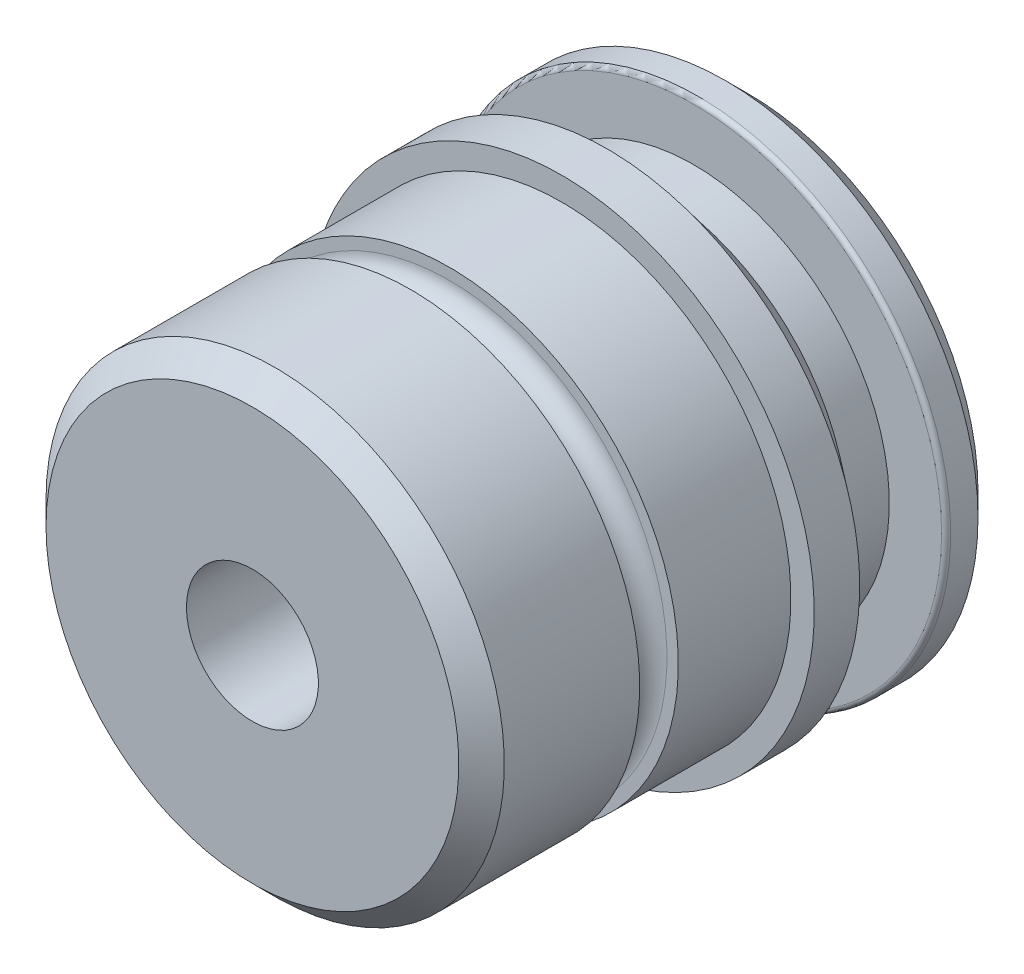
ISO-10303-21;
HEADER;
FILE_DESCRIPTION(('STEP AP214'),'2;1');
FILE_NAME('part.step','',(''),(''),'','','');
FILE_SCHEMA(('AUTOMOTIVE_DESIGN { 1 0 10303 214 1 1 1 1 }'));
ENDSEC;
DATA;
#1=APPLICATION_CONTEXT('core data for automotive mechanical design processes');
#2=APPLICATION_PROTOCOL_DEFINITION('international standard','automotive_design',2000,#1);
#3=PRODUCT_CONTEXT('',#1,'mechanical');
#4=PRODUCT('Part','Part','',(#3));
#5=PRODUCT_RELATED_PRODUCT_CATEGORY('part','',(#4));
#6=PRODUCT_DEFINITION_FORMATION('','',#4);
#7=PRODUCT_DEFINITION_CONTEXT('part definition',#1,'design');
#8=PRODUCT_DEFINITION('design','',#6,#7);
#9=PRODUCT_DEFINITION_SHAPE('','',#8);
#10=(LENGTH_UNIT() NAMED_UNIT(*) SI_UNIT(.MILLI.,.METRE.));
#11=(NAMED_UNIT(*) PLANE_ANGLE_UNIT() SI_UNIT($,.RADIAN.));
#12=(NAMED_UNIT(*) SI_UNIT($,.STERADIAN.) SOLID_ANGLE_UNIT());
#13=UNCERTAINTY_MEASURE_WITH_UNIT(LENGTH_MEASURE(1.E-05),#10,'distance_accuracy_value','');
#14=(GEOMETRIC_REPRESENTATION_CONTEXT(3) GLOBAL_UNCERTAINTY_ASSIGNED_CONTEXT((#13)) GLOBAL_UNIT_ASSIGNED_CONTEXT((#10,
#11,#12)) REPRESENTATION_CONTEXT('',''));
#15=CARTESIAN_POINT('',(0.,0.,0.));
#16=DIRECTION('',(0.,0.,1.));
#17=DIRECTION('',(1.,0.,0.));
#18=AXIS2_PLACEMENT_3D('',#15,#16,#17);
#19=CARTESIAN_POINT('',(11.1,0.,2.4));
#20=DIRECTION('',(0.,0.,-1.));
#21=DIRECTION('',(-1.,0.,0.));
#22=AXIS2_PLACEMENT_3D('',#19,#20,#21);
#23=PLANE('',#22);
#24=CARTESIAN_POINT('',(0.,0.,2.4));
#25=DIRECTION('',(0.,0.,-1.));
#26=DIRECTION('',(-1.,0.,0.));
#27=AXIS2_PLACEMENT_3D('',#24,#25,#26);
#28=CIRCLE('',#27,10.9);
#29=CARTESIAN_POINT('',(-10.9,0.,2.4));
#30=VERTEX_POINT('',#29);
#31=EDGE_CURVE('E10',#30,#30,#28,.F.);
#32=ORIENTED_EDGE('',*,*,#31,.T.);
#33=EDGE_LOOP('',(#32));
#34=FACE_BOUND('',#33,.T.);
#35=CARTESIAN_POINT('',(0.,0.,2.4));
#36=DIRECTION('',(0.,0.,-1.));
#37=DIRECTION('',(-1.,0.,0.));
#38=AXIS2_PLACEMENT_3D('',#35,#36,#37);
#39=CIRCLE('',#38,8.6);
#40=CARTESIAN_POINT('',(-8.6,0.,2.4));
#41=VERTEX_POINT('',#40);
#42=EDGE_CURVE('E107',#41,#41,#39,.T.);
#43=ORIENTED_EDGE('',*,*,#42,.T.);
#44=EDGE_LOOP('',(#43));
#45=FACE_BOUND('',#44,.T.);
#46=ADVANCED_FACE('F30',(#34,#45),#23,.F.);
#47=CARTESIAN_POINT('',(0.,0.,0.));
#48=DIRECTION('',(0.,0.,-1.));
#49=DIRECTION('',(-1.,0.,0.));
#50=AXIS2_PLACEMENT_3D('',#47,#48,#49);
#51=CYLINDRICAL_SURFACE('',#50,11.1);
#52=CARTESIAN_POINT('',(0.,0.,2.2));
#53=DIRECTION('',(0.,0.,-1.));
#54=DIRECTION('',(-1.,0.,0.));
#55=AXIS2_PLACEMENT_3D('',#52,#53,#54);
#56=CIRCLE('',#55,11.1);
#57=CARTESIAN_POINT('',(-11.1,0.,2.2));
#58=VERTEX_POINT('',#57);
#59=EDGE_CURVE('E37',#58,#58,#56,.T.);
#60=ORIENTED_EDGE('',*,*,#59,.T.);
#61=EDGE_LOOP('',(#60));
#62=FACE_BOUND('',#61,.T.);
#63=CARTESIAN_POINT('',(0.,0.,1.00000000000001));
#64=DIRECTION('',(0.,0.,1.));
#65=DIRECTION('',(1.,0.,0.));
#66=AXIS2_PLACEMENT_3D('',#63,#64,#65);
#67=CIRCLE('',#66,11.1);
#68=CARTESIAN_POINT('',(11.1,0.,1.00000000000001));
#69=VERTEX_POINT('',#68);
#70=EDGE_CURVE('E41',#69,#69,#67,.T.);
#71=ORIENTED_EDGE('',*,*,#70,.T.);
#72=EDGE_LOOP('',(#71));
#73=FACE_BOUND('',#72,.T.);
#74=ADVANCED_FACE('F173',(#62,#73),#51,.T.);
#75=CARTESIAN_POINT('',(11.1,0.,0.));
#76=DIRECTION('',(0.,0.,1.));
#77=DIRECTION('',(1.,0.,0.));
#78=AXIS2_PLACEMENT_3D('',#75,#76,#77);
#79=PLANE('',#78);
#80=CARTESIAN_POINT('',(0.,0.,0.));
#81=DIRECTION('',(0.,0.,1.));
#82=DIRECTION('',(1.,0.,0.));
#83=AXIS2_PLACEMENT_3D('',#80,#81,#82);
#84=CIRCLE('',#83,10.1);
#85=CARTESIAN_POINT('',(10.1,0.,0.));
#86=VERTEX_POINT('',#85);
#87=EDGE_CURVE('E45',#86,#86,#84,.F.);
#88=ORIENTED_EDGE('',*,*,#87,.T.);
#89=EDGE_LOOP('',(#88));
#90=FACE_BOUND('',#89,.T.);
#91=CARTESIAN_POINT('',(0.,0.,0.));
#92=DIRECTION('',(0.,0.,1.));
#93=DIRECTION('',(1.,0.,0.));
#94=AXIS2_PLACEMENT_3D('',#91,#92,#93);
#95=CIRCLE('',#94,6.50000000000001);
#96=CARTESIAN_POINT('',(6.50000000000001,0.,0.));
#97=VERTEX_POINT('',#96);
#98=EDGE_CURVE('E50',#97,#97,#95,.T.);
#99=ORIENTED_EDGE('',*,*,#98,.T.);
#100=EDGE_LOOP('',(#99));
#101=FACE_BOUND('',#100,.T.);
#102=ADVANCED_FACE('F178',(#90,#101),#79,.F.);
#103=CARTESIAN_POINT('',(0.,0.,0.));
#104=DIRECTION('',(0.,0.,-1.));
#105=DIRECTION('',(-1.,0.,0.));
#106=AXIS2_PLACEMENT_3D('',#103,#104,#105);
#107=CYLINDRICAL_SURFACE('',#106,5.5);
#108=CARTESIAN_POINT('',(0.,0.,1.));
#109=DIRECTION('',(0.,0.,1.));
#110=DIRECTION('',(1.,0.,0.));
#111=AXIS2_PLACEMENT_3D('',#108,#109,#110);
#112=CIRCLE('',#111,5.5);
#113=CARTESIAN_POINT('',(5.5,0.,1.));
#114=VERTEX_POINT('',#113);
#115=EDGE_CURVE('E53',#114,#114,#112,.F.);
#116=ORIENTED_EDGE('',*,*,#115,.T.);
#117=EDGE_LOOP('',(#116));
#118=FACE_BOUND('',#117,.T.);
#119=CARTESIAN_POINT('',(0.,0.,7.63730669589465));
#120=DIRECTION('',(0.,0.,-1.));
#121=DIRECTION('',(-1.,0.,0.));
#122=AXIS2_PLACEMENT_3D('',#119,#120,#121);
#123=CIRCLE('',#122,5.5);
#124=CARTESIAN_POINT('',(-5.5,0.,7.63730669589465));
#125=VERTEX_POINT('',#124);
#126=EDGE_CURVE('E62',#125,#125,#123,.T.);
#127=ORIENTED_EDGE('',*,*,#126,.F.);
#128=EDGE_LOOP('',(#127));
#129=FACE_BOUND('',#128,.T.);
#130=ADVANCED_FACE('F201',(#118,#129),#107,.F.);
#131=CARTESIAN_POINT('',(0.,0.,7.63730669589465));
#132=DIRECTION('',(0.,0.,-1.));
#133=DIRECTION('',(-1.,0.,0.));
#134=AXIS2_PLACEMENT_3D('',#131,#132,#133);
#135=CONICAL_SURFACE('',#134,5.5,1.30899693899575);
#136=CARTESIAN_POINT('',(0.,0.,8.2));
#137=DIRECTION('',(0.,0.,-1.));
#138=DIRECTION('',(-1.,0.,0.));
#139=AXIS2_PLACEMENT_3D('',#136,#137,#138);
#140=CIRCLE('',#139,3.4);
#141=CARTESIAN_POINT('',(-3.4,0.,8.2));
#142=VERTEX_POINT('',#141);
#143=EDGE_CURVE('E65',#142,#142,#140,.T.);
#144=ORIENTED_EDGE('',*,*,#143,.F.);
#145=EDGE_LOOP('',(#144));
#146=FACE_BOUND('',#145,.T.);
#147=ORIENTED_EDGE('',*,*,#126,.T.);
#148=EDGE_LOOP('',(#147));
#149=FACE_BOUND('',#148,.T.);
#150=ADVANCED_FACE('F208',(#146,#149),#135,.F.);
#151=CARTESIAN_POINT('',(0.,0.,0.));
#152=DIRECTION('',(0.,0.,-1.));
#153=DIRECTION('',(-1.,0.,0.));
#154=AXIS2_PLACEMENT_3D('',#151,#152,#153);
#155=CYLINDRICAL_SURFACE('',#154,3.4);
#156=CARTESIAN_POINT('',(0.,0.,10.));
#157=DIRECTION('',(0.,0.,-1.));
#158=DIRECTION('',(-1.,0.,0.));
#159=AXIS2_PLACEMENT_3D('',#156,#157,#158);
#160=CIRCLE('',#159,3.4);
#161=CARTESIAN_POINT('',(-3.4,0.,10.));
#162=VERTEX_POINT('',#161);
#163=EDGE_CURVE('E68',#162,#162,#160,.T.);
#164=ORIENTED_EDGE('',*,*,#163,.F.);
#165=EDGE_LOOP('',(#164));
#166=FACE_BOUND('',#165,.T.);
#167=ORIENTED_EDGE('',*,*,#143,.T.);
#168=EDGE_LOOP('',(#167));
#169=FACE_BOUND('',#168,.T.);
#170=ADVANCED_FACE('F213',(#166,#169),#155,.F.);
#171=CARTESIAN_POINT('',(4.4,0.,10.));
#172=DIRECTION('',(0.,0.,-1.));
#173=DIRECTION('',(-1.,0.,0.));
#174=AXIS2_PLACEMENT_3D('',#171,#172,#173);
#175=PLANE('',#174);
#176=CARTESIAN_POINT('',(0.,0.,10.));
#177=DIRECTION('',(0.,0.,-1.));
#178=DIRECTION('',(-1.,0.,0.));
#179=AXIS2_PLACEMENT_3D('',#176,#177,#178);
#180=CIRCLE('',#179,4.4);
#181=CARTESIAN_POINT('',(-4.4,0.,10.));
#182=VERTEX_POINT('',#181);
#183=EDGE_CURVE('E71',#182,#182,#180,.T.);
#184=ORIENTED_EDGE('',*,*,#183,.F.);
#185=EDGE_LOOP('',(#184));
#186=FACE_BOUND('',#185,.T.);
#187=ORIENTED_EDGE('',*,*,#163,.T.);
#188=EDGE_LOOP('',(#187));
#189=FACE_BOUND('',#188,.T.);
#190=ADVANCED_FACE('F219',(#186,#189),#175,.F.);
#191=CARTESIAN_POINT('',(0.,0.,0.));
#192=DIRECTION('',(0.,0.,-1.));
#193=DIRECTION('',(-1.,0.,0.));
#194=AXIS2_PLACEMENT_3D('',#191,#192,#193);
#195=CYLINDRICAL_SURFACE('',#194,4.4);
#196=CARTESIAN_POINT('',(0.,0.,11.8));
#197=DIRECTION('',(0.,0.,-1.));
#198=DIRECTION('',(-1.,0.,0.));
#199=AXIS2_PLACEMENT_3D('',#196,#197,#198);
#200=CIRCLE('',#199,4.4);
#201=CARTESIAN_POINT('',(-4.4,0.,11.8));
#202=VERTEX_POINT('',#201);
#203=EDGE_CURVE('E74',#202,#202,#200,.T.);
#204=ORIENTED_EDGE('',*,*,#203,.F.);
#205=EDGE_LOOP('',(#204));
#206=FACE_BOUND('',#205,.T.);
#207=ORIENTED_EDGE('',*,*,#183,.T.);
#208=EDGE_LOOP('',(#207));
#209=FACE_BOUND('',#208,.T.);
#210=ADVANCED_FACE('F226',(#206,#209),#195,.F.);
#211=CARTESIAN_POINT('',(2.9,0.,11.8));
#212=DIRECTION('',(0.,0.,1.));
#213=DIRECTION('',(1.,0.,0.));
#214=AXIS2_PLACEMENT_3D('',#211,#212,#213);
#215=PLANE('',#214);
#216=CARTESIAN_POINT('',(0.,0.,11.8));
#217=DIRECTION('',(0.,0.,-1.));
#218=DIRECTION('',(-1.,0.,0.));
#219=AXIS2_PLACEMENT_3D('',#216,#217,#218);
#220=CIRCLE('',#219,2.9);
#221=CARTESIAN_POINT('',(-2.9,0.,11.8));
#222=VERTEX_POINT('',#221);
#223=EDGE_CURVE('E77',#222,#222,#220,.T.);
#224=ORIENTED_EDGE('',*,*,#223,.F.);
#225=EDGE_LOOP('',(#224));
#226=FACE_BOUND('',#225,.T.);
#227=ORIENTED_EDGE('',*,*,#203,.T.);
#228=EDGE_LOOP('',(#227));
#229=FACE_BOUND('',#228,.T.);
#230=ADVANCED_FACE('F230',(#226,#229),#215,.F.);
#231=CARTESIAN_POINT('',(0.,0.,0.));
#232=DIRECTION('',(0.,0.,-1.));
#233=DIRECTION('',(-1.,0.,0.));
#234=AXIS2_PLACEMENT_3D('',#231,#232,#233);
#235=CYLINDRICAL_SURFACE('',#234,2.9);
#236=CARTESIAN_POINT('',(0.,0.,21.8));
#237=DIRECTION('',(0.,0.,-1.));
#238=DIRECTION('',(-1.,0.,0.));
#239=AXIS2_PLACEMENT_3D('',#236,#237,#238);
#240=CIRCLE('',#239,2.9);
#241=CARTESIAN_POINT('',(-2.9,0.,21.8));
#242=VERTEX_POINT('',#241);
#243=EDGE_CURVE('E80',#242,#242,#240,.T.);
#244=ORIENTED_EDGE('',*,*,#243,.F.);
#245=EDGE_LOOP('',(#244));
#246=FACE_BOUND('',#245,.T.);
#247=ORIENTED_EDGE('',*,*,#223,.T.);
#248=EDGE_LOOP('',(#247));
#249=FACE_BOUND('',#248,.T.);
#250=ADVANCED_FACE('F169',(#246,#249),#235,.F.);
#251=CARTESIAN_POINT('',(10.075,0.,21.8));
#252=DIRECTION('',(0.,0.,-1.));
#253=DIRECTION('',(-1.,0.,0.));
#254=AXIS2_PLACEMENT_3D('',#251,#252,#253);
#255=PLANE('',#254);
#256=CARTESIAN_POINT('',(0.,0.,21.8));
#257=DIRECTION('',(0.,0.,-1.));
#258=DIRECTION('',(-1.,0.,0.));
#259=AXIS2_PLACEMENT_3D('',#256,#257,#258);
#260=CIRCLE('',#259,9.07500000000002);
#261=CARTESIAN_POINT('',(-9.07500000000002,0.,21.8));
#262=VERTEX_POINT('',#261);
#263=EDGE_CURVE('E56',#262,#262,#260,.F.);
#264=ORIENTED_EDGE('',*,*,#263,.T.);
#265=EDGE_LOOP('',(#264));
#266=FACE_BOUND('',#265,.T.);
#267=ORIENTED_EDGE('',*,*,#243,.T.);
#268=EDGE_LOOP('',(#267));
#269=FACE_BOUND('',#268,.T.);
#270=ADVANCED_FACE('F163',(#266,#269),#255,.F.);
#271=CARTESIAN_POINT('',(0.,0.,0.));
#272=DIRECTION('',(0.,0.,-1.));
#273=DIRECTION('',(-1.,0.,0.));
#274=AXIS2_PLACEMENT_3D('',#271,#272,#273);
#275=CYLINDRICAL_SURFACE('',#274,10.075);
#276=CARTESIAN_POINT('',(0.,0.,20.8));
#277=DIRECTION('',(0.,0.,-1.));
#278=DIRECTION('',(-1.,0.,0.));
#279=AXIS2_PLACEMENT_3D('',#276,#277,#278);
#280=CIRCLE('',#279,10.075);
#281=CARTESIAN_POINT('',(-10.075,0.,20.8));
#282=VERTEX_POINT('',#281);
#283=EDGE_CURVE('E59',#282,#282,#280,.T.);
#284=ORIENTED_EDGE('',*,*,#283,.T.);
#285=EDGE_LOOP('',(#284));
#286=FACE_BOUND('',#285,.T.);
#287=CARTESIAN_POINT('',(0.,0.,14.85));
#288=DIRECTION('',(0.,0.,-1.));
#289=DIRECTION('',(-1.,0.,0.));
#290=AXIS2_PLACEMENT_3D('',#287,#288,#289);
#291=CIRCLE('',#290,10.075);
#292=CARTESIAN_POINT('',(-10.075,0.,14.85));
#293=VERTEX_POINT('',#292);
#294=EDGE_CURVE('E83',#293,#293,#291,.T.);
#295=ORIENTED_EDGE('',*,*,#294,.F.);
#296=EDGE_LOOP('',(#295));
#297=FACE_BOUND('',#296,.T.);
#298=ADVANCED_FACE('F158',(#286,#297),#275,.T.);
#299=CARTESIAN_POINT('',(9.57500000000002,0.,14.85));
#300=DIRECTION('',(0.,0.,1.));
#301=DIRECTION('',(1.,0.,0.));
#302=AXIS2_PLACEMENT_3D('',#299,#300,#301);
#303=PLANE('',#302);
#304=CARTESIAN_POINT('',(0.,0.,14.85));
#305=DIRECTION('',(0.,0.,-1.));
#306=DIRECTION('',(-1.,0.,0.));
#307=AXIS2_PLACEMENT_3D('',#304,#305,#306);
#308=CIRCLE('',#307,9.57500000000002);
#309=CARTESIAN_POINT('',(-9.57500000000002,0.,14.85));
#310=VERTEX_POINT('',#309);
#311=EDGE_CURVE('E86',#310,#310,#308,.T.);
#312=ORIENTED_EDGE('',*,*,#311,.F.);
#313=EDGE_LOOP('',(#312));
#314=FACE_BOUND('',#313,.T.);
#315=ORIENTED_EDGE('',*,*,#294,.T.);
#316=EDGE_LOOP('',(#315));
#317=FACE_BOUND('',#316,.T.);
#318=ADVANCED_FACE('F152',(#314,#317),#303,.F.);
#319=CARTESIAN_POINT('',(0.,0.,14.));
#320=DIRECTION('',(0.,0.,-1.));
#321=DIRECTION('',(-1.,0.,0.));
#322=AXIS2_PLACEMENT_3D('',#319,#320,#321);
#323=TOROIDAL_SURFACE('',#322,9.57500000000002,0.85);
#324=CARTESIAN_POINT('',(0.,0.,13.15));
#325=DIRECTION('',(0.,0.,-1.));
#326=DIRECTION('',(-1.,0.,0.));
#327=AXIS2_PLACEMENT_3D('',#324,#325,#326);
#328=CIRCLE('',#327,9.57500000000002);
#329=CARTESIAN_POINT('',(-9.57500000000002,0.,13.15));
#330=VERTEX_POINT('',#329);
#331=EDGE_CURVE('E89',#330,#330,#328,.T.);
#332=ORIENTED_EDGE('',*,*,#331,.F.);
#333=EDGE_LOOP('',(#332));
#334=FACE_BOUND('',#333,.T.);
#335=ORIENTED_EDGE('',*,*,#311,.T.);
#336=EDGE_LOOP('',(#335));
#337=FACE_BOUND('',#336,.T.);
#338=ADVANCED_FACE('F146',(#334,#337),#323,.F.);
#339=CARTESIAN_POINT('',(10.075,0.,13.15));
#340=DIRECTION('',(0.,0.,-1.));
#341=DIRECTION('',(-1.,0.,0.));
#342=AXIS2_PLACEMENT_3D('',#339,#340,#341);
#343=PLANE('',#342);
#344=CARTESIAN_POINT('',(0.,0.,13.15));
#345=DIRECTION('',(0.,0.,-1.));
#346=DIRECTION('',(-1.,0.,0.));
#347=AXIS2_PLACEMENT_3D('',#344,#345,#346);
#348=CIRCLE('',#347,10.075);
#349=CARTESIAN_POINT('',(-10.075,0.,13.15));
#350=VERTEX_POINT('',#349);
#351=EDGE_CURVE('E92',#350,#350,#348,.T.);
#352=ORIENTED_EDGE('',*,*,#351,.F.);
#353=EDGE_LOOP('',(#352));
#354=FACE_BOUND('',#353,.T.);
#355=ORIENTED_EDGE('',*,*,#331,.T.);
#356=EDGE_LOOP('',(#355));
#357=FACE_BOUND('',#356,.T.);
#358=ADVANCED_FACE('F140',(#354,#357),#343,.F.);
#359=CARTESIAN_POINT('',(0.,0.,0.));
#360=DIRECTION('',(0.,0.,-1.));
#361=DIRECTION('',(-1.,0.,0.));
#362=AXIS2_PLACEMENT_3D('',#359,#360,#361);
#363=CYLINDRICAL_SURFACE('',#362,10.075);
#364=CARTESIAN_POINT('',(0.,0.,8.2));
#365=DIRECTION('',(0.,0.,-1.));
#366=DIRECTION('',(-1.,0.,0.));
#367=AXIS2_PLACEMENT_3D('',#364,#365,#366);
#368=CIRCLE('',#367,10.075);
#369=CARTESIAN_POINT('',(-10.075,0.,8.2));
#370=VERTEX_POINT('',#369);
#371=EDGE_CURVE('E95',#370,#370,#368,.T.);
#372=ORIENTED_EDGE('',*,*,#371,.F.);
#373=EDGE_LOOP('',(#372));
#374=FACE_BOUND('',#373,.T.);
#375=ORIENTED_EDGE('',*,*,#351,.T.);
#376=EDGE_LOOP('',(#375));
#377=FACE_BOUND('',#376,.T.);
#378=ADVANCED_FACE('F134',(#374,#377),#363,.T.);
#379=CARTESIAN_POINT('',(11.1,0.,8.2));
#380=DIRECTION('',(0.,0.,-1.));
#381=DIRECTION('',(-1.,0.,0.));
#382=AXIS2_PLACEMENT_3D('',#379,#380,#381);
#383=PLANE('',#382);
#384=CARTESIAN_POINT('',(0.,0.,8.2));
#385=DIRECTION('',(0.,0.,-1.));
#386=DIRECTION('',(-1.,0.,0.));
#387=AXIS2_PLACEMENT_3D('',#384,#385,#386);
#388=CIRCLE('',#387,11.1);
#389=CARTESIAN_POINT('',(-11.1,0.,8.2));
#390=VERTEX_POINT('',#389);
#391=EDGE_CURVE('E98',#390,#390,#388,.T.);
#392=ORIENTED_EDGE('',*,*,#391,.F.);
#393=EDGE_LOOP('',(#392));
#394=FACE_BOUND('',#393,.T.);
#395=ORIENTED_EDGE('',*,*,#371,.T.);
#396=EDGE_LOOP('',(#395));
#397=FACE_BOUND('',#396,.T.);
#398=ADVANCED_FACE('F128',(#394,#397),#383,.F.);
#399=CARTESIAN_POINT('',(0.,0.,0.));
#400=DIRECTION('',(0.,0.,-1.));
#401=DIRECTION('',(-1.,0.,0.));
#402=AXIS2_PLACEMENT_3D('',#399,#400,#401);
#403=CYLINDRICAL_SURFACE('',#402,11.1);
#404=CARTESIAN_POINT('',(0.,0.,6.2));
#405=DIRECTION('',(0.,0.,-1.));
#406=DIRECTION('',(-1.,0.,0.));
#407=AXIS2_PLACEMENT_3D('',#404,#405,#406);
#408=CIRCLE('',#407,11.1);
#409=CARTESIAN_POINT('',(-11.1,0.,6.2));
#410=VERTEX_POINT('',#409);
#411=EDGE_CURVE('E101',#410,#410,#408,.T.);
#412=ORIENTED_EDGE('',*,*,#411,.F.);
#413=EDGE_LOOP('',(#412));
#414=FACE_BOUND('',#413,.T.);
#415=ORIENTED_EDGE('',*,*,#391,.T.);
#416=EDGE_LOOP('',(#415));
#417=FACE_BOUND('',#416,.T.);
#418=ADVANCED_FACE('F122',(#414,#417),#403,.T.);
#419=CARTESIAN_POINT('',(0.,0.,6.2));
#420=DIRECTION('',(0.,0.,1.));
#421=DIRECTION('',(1.,0.,0.));
#422=AXIS2_PLACEMENT_3D('',#419,#420,#421);
#423=CONICAL_SURFACE('',#422,11.1,0.896055384571345);
#424=CARTESIAN_POINT('',(0.,0.,4.2));
#425=DIRECTION('',(0.,0.,-1.));
#426=DIRECTION('',(-1.,0.,0.));
#427=AXIS2_PLACEMENT_3D('',#424,#425,#426);
#428=CIRCLE('',#427,8.6);
#429=CARTESIAN_POINT('',(-8.6,0.,4.2));
#430=VERTEX_POINT('',#429);
#431=EDGE_CURVE('E104',#430,#430,#428,.T.);
#432=ORIENTED_EDGE('',*,*,#431,.F.);
#433=EDGE_LOOP('',(#432));
#434=FACE_BOUND('',#433,.T.);
#435=ORIENTED_EDGE('',*,*,#411,.T.);
#436=EDGE_LOOP('',(#435));
#437=FACE_BOUND('',#436,.T.);
#438=ADVANCED_FACE('F116',(#434,#437),#423,.T.);
#439=CARTESIAN_POINT('',(0.,0.,0.));
#440=DIRECTION('',(0.,0.,-1.));
#441=DIRECTION('',(-1.,0.,0.));
#442=AXIS2_PLACEMENT_3D('',#439,#440,#441);
#443=CYLINDRICAL_SURFACE('',#442,8.6);
#444=ORIENTED_EDGE('',*,*,#42,.F.);
#445=EDGE_LOOP('',(#444));
#446=FACE_BOUND('',#445,.T.);
#447=ORIENTED_EDGE('',*,*,#431,.T.);
#448=EDGE_LOOP('',(#447));
#449=FACE_BOUND('',#448,.T.);
#450=ADVANCED_FACE('F112',(#446,#449),#443,.T.);
#451=CARTESIAN_POINT('',(0.,0.,20.8));
#452=DIRECTION('',(0.,0.,-1.));
#453=DIRECTION('',(-1.,0.,0.));
#454=AXIS2_PLACEMENT_3D('',#451,#452,#453);
#455=CONICAL_SURFACE('',#454,10.075,0.785398163397449);
#456=ORIENTED_EDGE('',*,*,#263,.F.);
#457=EDGE_LOOP('',(#456));
#458=FACE_BOUND('',#457,.T.);
#459=ORIENTED_EDGE('',*,*,#283,.F.);
#460=EDGE_LOOP('',(#459));
#461=FACE_BOUND('',#460,.T.);
#462=ADVANCED_FACE('F115',(#458,#461),#455,.T.);
#463=CARTESIAN_POINT('',(0.,0.,1.));
#464=DIRECTION('',(0.,0.,-1.));
#465=DIRECTION('',(-1.,0.,0.));
#466=AXIS2_PLACEMENT_3D('',#463,#464,#465);
#467=CONICAL_SURFACE('',#466,5.5,0.785398163397453);
#468=ORIENTED_EDGE('',*,*,#98,.F.);
#469=EDGE_LOOP('',(#468));
#470=FACE_BOUND('',#469,.T.);
#471=ORIENTED_EDGE('',*,*,#115,.F.);
#472=EDGE_LOOP('',(#471));
#473=FACE_BOUND('',#472,.T.);
#474=ADVANCED_FACE('F184',(#470,#473),#467,.F.);
#475=CARTESIAN_POINT('',(0.,0.,0.));
#476=DIRECTION('',(0.,0.,1.));
#477=DIRECTION('',(1.,0.,0.));
#478=AXIS2_PLACEMENT_3D('',#475,#476,#477);
#479=CONICAL_SURFACE('',#478,10.1,0.785398163397447);
#480=ORIENTED_EDGE('',*,*,#70,.F.);
#481=EDGE_LOOP('',(#480));
#482=FACE_BOUND('',#481,.T.);
#483=ORIENTED_EDGE('',*,*,#87,.F.);
#484=EDGE_LOOP('',(#483));
#485=FACE_BOUND('',#484,.T.);
#486=ADVANCED_FACE('F187',(#482,#485),#479,.T.);
#487=CARTESIAN_POINT('',(0.,0.,2.2));
#488=DIRECTION('',(0.,0.,-1.));
#489=DIRECTION('',(-1.,0.,0.));
#490=AXIS2_PLACEMENT_3D('',#487,#488,#489);
#491=TOROIDAL_SURFACE('',#490,10.9,0.2);
#492=ORIENTED_EDGE('',*,*,#31,.F.);
#493=EDGE_LOOP('',(#492));
#494=FACE_BOUND('',#493,.T.);
#495=ORIENTED_EDGE('',*,*,#59,.F.);
#496=EDGE_LOOP('',(#495));
#497=FACE_BOUND('',#496,.T.);
#498=ADVANCED_FACE('F32',(#494,#497),#491,.T.);
#499=CLOSED_SHELL('',(#46,#74,#102,#130,#150,#170,#190,#210,#230,#250,#270,#298,#318,#338,#358,
#378,#398,#418,#438,#450,#462,#474,#486,#498));
#500=MANIFOLD_SOLID_BREP('B2',#499);
#501=ADVANCED_BREP_SHAPE_REPRESENTATION('',(#18,#500),#14);
#502=SHAPE_DEFINITION_REPRESENTATION(#9,#501);
ENDSEC;
END-ISO-10303-21;
